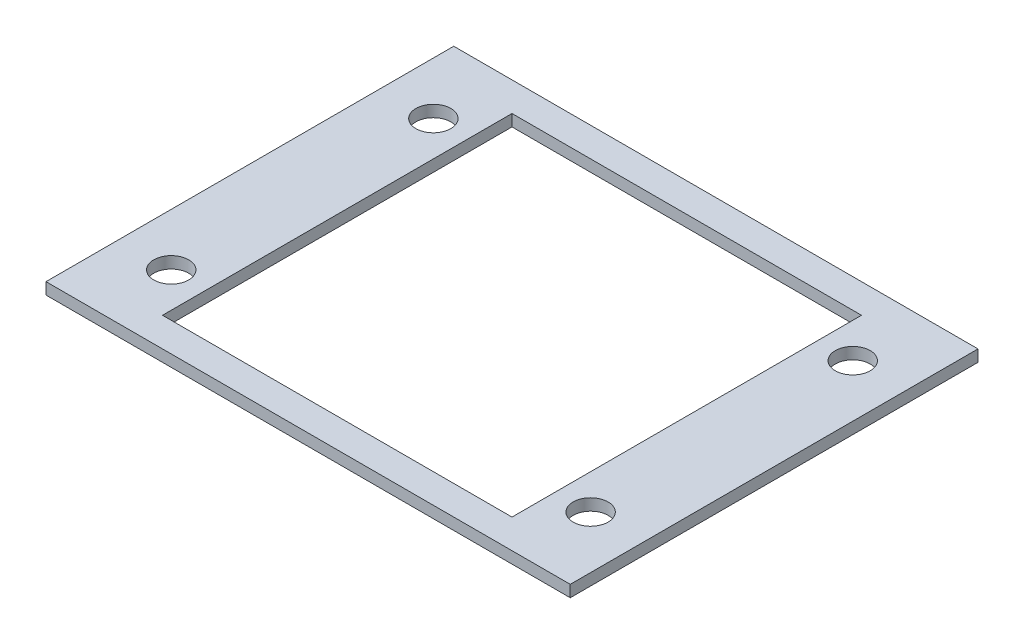
ISO-10303-21;
HEADER;
FILE_DESCRIPTION(('STEP AP214'),'2;1');
FILE_NAME('part.step','',(''),(''),'','','');
FILE_SCHEMA(('AUTOMOTIVE_DESIGN { 1 0 10303 214 1 1 1 1 }'));
ENDSEC;
DATA;
#1=APPLICATION_CONTEXT('core data for automotive mechanical design processes');
#2=APPLICATION_PROTOCOL_DEFINITION('international standard','automotive_design',2000,#1);
#3=PRODUCT_CONTEXT('',#1,'mechanical');
#4=PRODUCT('Part','Part','',(#3));
#5=PRODUCT_RELATED_PRODUCT_CATEGORY('part','',(#4));
#6=PRODUCT_DEFINITION_FORMATION('','',#4);
#7=PRODUCT_DEFINITION_CONTEXT('part definition',#1,'design');
#8=PRODUCT_DEFINITION('design','',#6,#7);
#9=PRODUCT_DEFINITION_SHAPE('','',#8);
#10=(LENGTH_UNIT() NAMED_UNIT(*) SI_UNIT(.MILLI.,.METRE.));
#11=(NAMED_UNIT(*) PLANE_ANGLE_UNIT() SI_UNIT($,.RADIAN.));
#12=(NAMED_UNIT(*) SI_UNIT($,.STERADIAN.) SOLID_ANGLE_UNIT());
#13=UNCERTAINTY_MEASURE_WITH_UNIT(LENGTH_MEASURE(1.E-05),#10,'distance_accuracy_value','');
#14=(GEOMETRIC_REPRESENTATION_CONTEXT(3) GLOBAL_UNCERTAINTY_ASSIGNED_CONTEXT((#13)) GLOBAL_UNIT_ASSIGNED_CONTEXT((#10,
#11,#12)) REPRESENTATION_CONTEXT('',''));
#15=CARTESIAN_POINT('',(0.,0.,0.));
#16=DIRECTION('',(0.,0.,1.));
#17=DIRECTION('',(1.,0.,0.));
#18=AXIS2_PLACEMENT_3D('',#15,#16,#17);
#19=CARTESIAN_POINT('',(-7.5,1.,0.));
#20=DIRECTION('',(-1.,0.,0.));
#21=DIRECTION('',(0.,0.,1.));
#22=AXIS2_PLACEMENT_3D('',#19,#20,#21);
#23=PLANE('',#22);
#24=DIRECTION('',(0.,1.,0.));
#25=VECTOR('',#24,1.);
#26=CARTESIAN_POINT('',(-7.5,-9.,-32.5));
#27=LINE('',#26,#25);
#28=CARTESIAN_POINT('',(-7.5,0.,-32.5));
#29=VERTEX_POINT('',#28);
#30=CARTESIAN_POINT('',(-7.5,1.,-32.5));
#31=VERTEX_POINT('',#30);
#32=EDGE_CURVE('E97',#29,#31,#27,.T.);
#33=ORIENTED_EDGE('',*,*,#32,.F.);
#34=DIRECTION('',(0.,0.,-1.));
#35=VECTOR('',#34,1.);
#36=CARTESIAN_POINT('',(-7.5,0.,0.));
#37=LINE('',#36,#35);
#38=CARTESIAN_POINT('',(-7.5,0.,2.5));
#39=VERTEX_POINT('',#38);
#40=EDGE_CURVE('E149',#39,#29,#37,.T.);
#41=ORIENTED_EDGE('',*,*,#40,.F.);
#42=DIRECTION('',(0.,1.,0.));
#43=VECTOR('',#42,1.);
#44=CARTESIAN_POINT('',(-7.5,-9.,2.5));
#45=LINE('',#44,#43);
#46=CARTESIAN_POINT('',(-7.5,1.,2.5));
#47=VERTEX_POINT('',#46);
#48=EDGE_CURVE('E57',#39,#47,#45,.T.);
#49=ORIENTED_EDGE('',*,*,#48,.T.);
#50=DIRECTION('',(0.,0.,-1.));
#51=VECTOR('',#50,1.);
#52=CARTESIAN_POINT('',(-7.5,1.,0.));
#53=LINE('',#52,#51);
#54=EDGE_CURVE('E112',#47,#31,#53,.T.);
#55=ORIENTED_EDGE('',*,*,#54,.T.);
#56=EDGE_LOOP('',(#33,#41,#49,#55));
#57=FACE_BOUND('',#56,.T.);
#58=ADVANCED_FACE('F35',(#57),#23,.T.);
#59=CARTESIAN_POINT('',(37.5,1.,0.));
#60=DIRECTION('',(-1.,0.,0.));
#61=DIRECTION('',(0.,0.,1.));
#62=AXIS2_PLACEMENT_3D('',#59,#60,#61);
#63=PLANE('',#62);
#64=DIRECTION('',(0.,0.,-1.));
#65=VECTOR('',#64,1.);
#66=CARTESIAN_POINT('',(37.5,0.,0.));
#67=LINE('',#66,#65);
#68=CARTESIAN_POINT('',(37.5,0.,2.5));
#69=VERTEX_POINT('',#68);
#70=CARTESIAN_POINT('',(37.5,0.,-32.5));
#71=VERTEX_POINT('',#70);
#72=EDGE_CURVE('E151',#69,#71,#67,.T.);
#73=ORIENTED_EDGE('',*,*,#72,.T.);
#74=DIRECTION('',(0.,1.,0.));
#75=VECTOR('',#74,1.);
#76=CARTESIAN_POINT('',(37.5,-9.,-32.5));
#77=LINE('',#76,#75);
#78=CARTESIAN_POINT('',(37.5,1.,-32.5));
#79=VERTEX_POINT('',#78);
#80=EDGE_CURVE('E50',#71,#79,#77,.T.);
#81=ORIENTED_EDGE('',*,*,#80,.T.);
#82=DIRECTION('',(0.,0.,-1.));
#83=VECTOR('',#82,1.);
#84=CARTESIAN_POINT('',(37.5,1.,0.));
#85=LINE('',#84,#83);
#86=CARTESIAN_POINT('',(37.5,1.,2.5));
#87=VERTEX_POINT('',#86);
#88=EDGE_CURVE('E114',#87,#79,#85,.T.);
#89=ORIENTED_EDGE('',*,*,#88,.F.);
#90=DIRECTION('',(0.,1.,0.));
#91=VECTOR('',#90,1.);
#92=CARTESIAN_POINT('',(37.5,-9.,2.5));
#93=LINE('',#92,#91);
#94=EDGE_CURVE('E167',#69,#87,#93,.T.);
#95=ORIENTED_EDGE('',*,*,#94,.F.);
#96=EDGE_LOOP('',(#73,#81,#89,#95));
#97=FACE_BOUND('',#96,.T.);
#98=ADVANCED_FACE('F169',(#97),#63,.F.);
#99=CARTESIAN_POINT('',(30.,1.,0.));
#100=DIRECTION('',(-1.,0.,0.));
#101=DIRECTION('',(0.,0.,1.));
#102=AXIS2_PLACEMENT_3D('',#99,#100,#101);
#103=PLANE('',#102);
#104=DIRECTION('',(0.,0.,-1.));
#105=VECTOR('',#104,1.);
#106=CARTESIAN_POINT('',(30.,0.,0.));
#107=LINE('',#106,#105);
#108=CARTESIAN_POINT('',(30.,0.,0.));
#109=VERTEX_POINT('',#108);
#110=CARTESIAN_POINT('',(30.,0.,-30.));
#111=VERTEX_POINT('',#110);
#112=EDGE_CURVE('E134',#109,#111,#107,.T.);
#113=ORIENTED_EDGE('',*,*,#112,.F.);
#114=DIRECTION('',(0.,-1.,0.));
#115=VECTOR('',#114,1.);
#116=CARTESIAN_POINT('',(30.,1.,0.));
#117=LINE('',#116,#115);
#118=CARTESIAN_POINT('',(30.,1.,0.));
#119=VERTEX_POINT('',#118);
#120=EDGE_CURVE('E161',#119,#109,#117,.T.);
#121=ORIENTED_EDGE('',*,*,#120,.F.);
#122=DIRECTION('',(0.,0.,-1.));
#123=VECTOR('',#122,1.);
#124=CARTESIAN_POINT('',(30.,1.,0.));
#125=LINE('',#124,#123);
#126=CARTESIAN_POINT('',(30.,1.,-30.));
#127=VERTEX_POINT('',#126);
#128=EDGE_CURVE('E183',#119,#127,#125,.T.);
#129=ORIENTED_EDGE('',*,*,#128,.T.);
#130=DIRECTION('',(0.,-1.,0.));
#131=VECTOR('',#130,1.);
#132=CARTESIAN_POINT('',(30.,1.,-30.));
#133=LINE('',#132,#131);
#134=EDGE_CURVE('E118',#127,#111,#133,.T.);
#135=ORIENTED_EDGE('',*,*,#134,.T.);
#136=EDGE_LOOP('',(#113,#121,#129,#135));
#137=FACE_BOUND('',#136,.T.);
#138=ADVANCED_FACE('F202',(#137),#103,.T.);
#139=CARTESIAN_POINT('',(0.,1.,0.));
#140=DIRECTION('',(0.,0.,-1.));
#141=DIRECTION('',(-1.,0.,0.));
#142=AXIS2_PLACEMENT_3D('',#139,#140,#141);
#143=PLANE('',#142);
#144=DIRECTION('',(1.,0.,0.));
#145=VECTOR('',#144,1.);
#146=CARTESIAN_POINT('',(0.,0.,0.));
#147=LINE('',#146,#145);
#148=CARTESIAN_POINT('',(0.,0.,0.));
#149=VERTEX_POINT('',#148);
#150=EDGE_CURVE('E137',#149,#109,#147,.T.);
#151=ORIENTED_EDGE('',*,*,#150,.F.);
#152=DIRECTION('',(0.,-1.,0.));
#153=VECTOR('',#152,1.);
#154=CARTESIAN_POINT('',(0.,1.,0.));
#155=LINE('',#154,#153);
#156=CARTESIAN_POINT('',(0.,1.,0.));
#157=VERTEX_POINT('',#156);
#158=EDGE_CURVE('E159',#157,#149,#155,.T.);
#159=ORIENTED_EDGE('',*,*,#158,.F.);
#160=DIRECTION('',(1.,0.,0.));
#161=VECTOR('',#160,1.);
#162=CARTESIAN_POINT('',(0.,1.,0.));
#163=LINE('',#162,#161);
#164=EDGE_CURVE('E186',#157,#119,#163,.T.);
#165=ORIENTED_EDGE('',*,*,#164,.T.);
#166=ORIENTED_EDGE('',*,*,#120,.T.);
#167=EDGE_LOOP('',(#151,#159,#165,#166));
#168=FACE_BOUND('',#167,.T.);
#169=ADVANCED_FACE('F205',(#168),#143,.T.);
#170=CARTESIAN_POINT('',(0.,1.,0.));
#171=DIRECTION('',(-1.,0.,0.));
#172=DIRECTION('',(0.,0.,1.));
#173=AXIS2_PLACEMENT_3D('',#170,#171,#172);
#174=PLANE('',#173);
#175=DIRECTION('',(0.,0.,-1.));
#176=VECTOR('',#175,1.);
#177=CARTESIAN_POINT('',(0.,0.,0.));
#178=LINE('',#177,#176);
#179=CARTESIAN_POINT('',(0.,0.,-30.));
#180=VERTEX_POINT('',#179);
#181=EDGE_CURVE('E140',#149,#180,#178,.T.);
#182=ORIENTED_EDGE('',*,*,#181,.T.);
#183=DIRECTION('',(0.,-1.,0.));
#184=VECTOR('',#183,1.);
#185=CARTESIAN_POINT('',(0.,1.,-30.));
#186=LINE('',#185,#184);
#187=CARTESIAN_POINT('',(0.,1.,-30.));
#188=VERTEX_POINT('',#187);
#189=EDGE_CURVE('E156',#188,#180,#186,.T.);
#190=ORIENTED_EDGE('',*,*,#189,.F.);
#191=DIRECTION('',(0.,0.,-1.));
#192=VECTOR('',#191,1.);
#193=CARTESIAN_POINT('',(0.,1.,0.));
#194=LINE('',#193,#192);
#195=EDGE_CURVE('E189',#157,#188,#194,.T.);
#196=ORIENTED_EDGE('',*,*,#195,.F.);
#197=ORIENTED_EDGE('',*,*,#158,.T.);
#198=EDGE_LOOP('',(#182,#190,#196,#197));
#199=FACE_BOUND('',#198,.T.);
#200=ADVANCED_FACE('F208',(#199),#174,.F.);
#201=CARTESIAN_POINT('',(-3.,1.,-3.75000000000001));
#202=DIRECTION('',(0.,-1.,0.));
#203=DIRECTION('',(0.,0.,-1.));
#204=AXIS2_PLACEMENT_3D('',#201,#202,#203);
#205=CYLINDRICAL_SURFACE('',#204,1.5);
#206=CARTESIAN_POINT('',(-3.,1.,-3.75000000000001));
#207=DIRECTION('',(0.,1.,0.));
#208=DIRECTION('',(0.,0.,1.));
#209=AXIS2_PLACEMENT_3D('',#206,#207,#208);
#210=CIRCLE('',#209,1.5);
#211=CARTESIAN_POINT('',(-3.,1.,-2.25000000000001));
#212=VERTEX_POINT('',#211);
#213=EDGE_CURVE('E116',#212,#212,#210,.F.);
#214=ORIENTED_EDGE('',*,*,#213,.F.);
#215=EDGE_LOOP('',(#214));
#216=FACE_BOUND('',#215,.T.);
#217=CARTESIAN_POINT('',(-3.,0.,-3.75000000000001));
#218=DIRECTION('',(0.,1.,0.));
#219=DIRECTION('',(0.,0.,1.));
#220=AXIS2_PLACEMENT_3D('',#217,#218,#219);
#221=CIRCLE('',#220,1.5);
#222=CARTESIAN_POINT('',(-3.,0.,-2.25000000000001));
#223=VERTEX_POINT('',#222);
#224=EDGE_CURVE('E146',#223,#223,#221,.F.);
#225=ORIENTED_EDGE('',*,*,#224,.T.);
#226=EDGE_LOOP('',(#225));
#227=FACE_BOUND('',#226,.T.);
#228=ADVANCED_FACE('F216',(#216,#227),#205,.F.);
#229=CARTESIAN_POINT('',(0.,1.,-30.));
#230=DIRECTION('',(0.,0.,-1.));
#231=DIRECTION('',(-1.,0.,0.));
#232=AXIS2_PLACEMENT_3D('',#229,#230,#231);
#233=PLANE('',#232);
#234=DIRECTION('',(1.,0.,0.));
#235=VECTOR('',#234,1.);
#236=CARTESIAN_POINT('',(0.,0.,-30.));
#237=LINE('',#236,#235);
#238=EDGE_CURVE('E143',#180,#111,#237,.T.);
#239=ORIENTED_EDGE('',*,*,#238,.T.);
#240=ORIENTED_EDGE('',*,*,#134,.F.);
#241=DIRECTION('',(1.,0.,0.));
#242=VECTOR('',#241,1.);
#243=CARTESIAN_POINT('',(0.,1.,-30.));
#244=LINE('',#243,#242);
#245=EDGE_CURVE('E121',#188,#127,#244,.T.);
#246=ORIENTED_EDGE('',*,*,#245,.F.);
#247=ORIENTED_EDGE('',*,*,#189,.T.);
#248=EDGE_LOOP('',(#239,#240,#246,#247));
#249=FACE_BOUND('',#248,.T.);
#250=ADVANCED_FACE('F199',(#249),#233,.F.);
#251=CARTESIAN_POINT('',(-3.,1.,-26.25));
#252=DIRECTION('',(0.,-1.,0.));
#253=DIRECTION('',(0.,0.,-1.));
#254=AXIS2_PLACEMENT_3D('',#251,#252,#253);
#255=CYLINDRICAL_SURFACE('',#254,1.5);
#256=CARTESIAN_POINT('',(-3.,1.,-26.25));
#257=DIRECTION('',(0.,1.,0.));
#258=DIRECTION('',(0.,0.,1.));
#259=AXIS2_PLACEMENT_3D('',#256,#257,#258);
#260=CIRCLE('',#259,1.5);
#261=CARTESIAN_POINT('',(-3.,1.,-24.75));
#262=VERTEX_POINT('',#261);
#263=EDGE_CURVE('E180',#262,#262,#260,.F.);
#264=ORIENTED_EDGE('',*,*,#263,.F.);
#265=EDGE_LOOP('',(#264));
#266=FACE_BOUND('',#265,.T.);
#267=CARTESIAN_POINT('',(-3.,0.,-26.25));
#268=DIRECTION('',(0.,1.,0.));
#269=DIRECTION('',(0.,0.,1.));
#270=AXIS2_PLACEMENT_3D('',#267,#268,#269);
#271=CIRCLE('',#270,1.5);
#272=CARTESIAN_POINT('',(-3.,0.,-24.75));
#273=VERTEX_POINT('',#272);
#274=EDGE_CURVE('E131',#273,#273,#271,.F.);
#275=ORIENTED_EDGE('',*,*,#274,.T.);
#276=EDGE_LOOP('',(#275));
#277=FACE_BOUND('',#276,.T.);
#278=ADVANCED_FACE('F224',(#266,#277),#255,.F.);
#279=CARTESIAN_POINT('',(33.,1.,-26.25));
#280=DIRECTION('',(0.,-1.,0.));
#281=DIRECTION('',(0.,0.,-1.));
#282=AXIS2_PLACEMENT_3D('',#279,#280,#281);
#283=CYLINDRICAL_SURFACE('',#282,1.5);
#284=CARTESIAN_POINT('',(33.,1.,-26.25));
#285=DIRECTION('',(0.,1.,0.));
#286=DIRECTION('',(0.,0.,1.));
#287=AXIS2_PLACEMENT_3D('',#284,#285,#286);
#288=CIRCLE('',#287,1.5);
#289=CARTESIAN_POINT('',(33.,1.,-24.75));
#290=VERTEX_POINT('',#289);
#291=EDGE_CURVE('E177',#290,#290,#288,.T.);
#292=ORIENTED_EDGE('',*,*,#291,.T.);
#293=EDGE_LOOP('',(#292));
#294=FACE_BOUND('',#293,.T.);
#295=CARTESIAN_POINT('',(33.,0.,-26.25));
#296=DIRECTION('',(0.,1.,0.));
#297=DIRECTION('',(0.,0.,1.));
#298=AXIS2_PLACEMENT_3D('',#295,#296,#297);
#299=CIRCLE('',#298,1.5);
#300=CARTESIAN_POINT('',(33.,0.,-24.75));
#301=VERTEX_POINT('',#300);
#302=EDGE_CURVE('E128',#301,#301,#299,.T.);
#303=ORIENTED_EDGE('',*,*,#302,.F.);
#304=EDGE_LOOP('',(#303));
#305=FACE_BOUND('',#304,.T.);
#306=ADVANCED_FACE('F261',(#294,#305),#283,.F.);
#307=CARTESIAN_POINT('',(33.,1.,-3.75000000000001));
#308=DIRECTION('',(0.,-1.,0.));
#309=DIRECTION('',(0.,0.,-1.));
#310=AXIS2_PLACEMENT_3D('',#307,#308,#309);
#311=CYLINDRICAL_SURFACE('',#310,1.5);
#312=CARTESIAN_POINT('',(33.,1.,-3.75000000000001));
#313=DIRECTION('',(0.,1.,0.));
#314=DIRECTION('',(0.,0.,1.));
#315=AXIS2_PLACEMENT_3D('',#312,#313,#314);
#316=CIRCLE('',#315,1.5);
#317=CARTESIAN_POINT('',(33.,1.,-2.25));
#318=VERTEX_POINT('',#317);
#319=EDGE_CURVE('E154',#318,#318,#316,.T.);
#320=ORIENTED_EDGE('',*,*,#319,.T.);
#321=EDGE_LOOP('',(#320));
#322=FACE_BOUND('',#321,.T.);
#323=CARTESIAN_POINT('',(33.,0.,-3.75000000000001));
#324=DIRECTION('',(0.,1.,0.));
#325=DIRECTION('',(0.,0.,1.));
#326=AXIS2_PLACEMENT_3D('',#323,#324,#325);
#327=CIRCLE('',#326,1.5);
#328=CARTESIAN_POINT('',(33.,0.,-2.25));
#329=VERTEX_POINT('',#328);
#330=EDGE_CURVE('E125',#329,#329,#327,.T.);
#331=ORIENTED_EDGE('',*,*,#330,.F.);
#332=EDGE_LOOP('',(#331));
#333=FACE_BOUND('',#332,.T.);
#334=ADVANCED_FACE('F37',(#322,#333),#311,.F.);
#335=CARTESIAN_POINT('',(0.,1.,0.));
#336=DIRECTION('',(0.,1.,0.));
#337=DIRECTION('',(0.,0.,1.));
#338=AXIS2_PLACEMENT_3D('',#335,#336,#337);
#339=PLANE('',#338);
#340=DIRECTION('',(1.,0.,0.));
#341=VECTOR('',#340,1.);
#342=CARTESIAN_POINT('',(-7.5,1.,-32.5));
#343=LINE('',#342,#341);
#344=EDGE_CURVE('E100',#31,#79,#343,.T.);
#345=ORIENTED_EDGE('',*,*,#344,.F.);
#346=ORIENTED_EDGE('',*,*,#54,.F.);
#347=DIRECTION('',(-1.,0.,0.));
#348=VECTOR('',#347,1.);
#349=CARTESIAN_POINT('',(37.5,1.,2.5));
#350=LINE('',#349,#348);
#351=EDGE_CURVE('E170',#87,#47,#350,.T.);
#352=ORIENTED_EDGE('',*,*,#351,.F.);
#353=ORIENTED_EDGE('',*,*,#88,.T.);
#354=EDGE_LOOP('',(#345,#346,#352,#353));
#355=FACE_BOUND('',#354,.T.);
#356=ORIENTED_EDGE('',*,*,#319,.F.);
#357=EDGE_LOOP('',(#356));
#358=FACE_BOUND('',#357,.T.);
#359=ORIENTED_EDGE('',*,*,#291,.F.);
#360=EDGE_LOOP('',(#359));
#361=FACE_BOUND('',#360,.T.);
#362=ORIENTED_EDGE('',*,*,#263,.T.);
#363=EDGE_LOOP('',(#362));
#364=FACE_BOUND('',#363,.T.);
#365=ORIENTED_EDGE('',*,*,#128,.F.);
#366=ORIENTED_EDGE('',*,*,#164,.F.);
#367=ORIENTED_EDGE('',*,*,#195,.T.);
#368=ORIENTED_EDGE('',*,*,#245,.T.);
#369=EDGE_LOOP('',(#365,#366,#367,#368));
#370=FACE_BOUND('',#369,.T.);
#371=ORIENTED_EDGE('',*,*,#213,.T.);
#372=EDGE_LOOP('',(#371));
#373=FACE_BOUND('',#372,.T.);
#374=ADVANCED_FACE('F109',(#355,#358,#361,#364,#370,#373),#339,.T.);
#375=CARTESIAN_POINT('',(0.,0.,0.));
#376=DIRECTION('',(0.,1.,0.));
#377=DIRECTION('',(0.,0.,1.));
#378=AXIS2_PLACEMENT_3D('',#375,#376,#377);
#379=PLANE('',#378);
#380=ORIENTED_EDGE('',*,*,#330,.T.);
#381=EDGE_LOOP('',(#380));
#382=FACE_BOUND('',#381,.T.);
#383=ORIENTED_EDGE('',*,*,#302,.T.);
#384=EDGE_LOOP('',(#383));
#385=FACE_BOUND('',#384,.T.);
#386=ORIENTED_EDGE('',*,*,#274,.F.);
#387=EDGE_LOOP('',(#386));
#388=FACE_BOUND('',#387,.T.);
#389=ORIENTED_EDGE('',*,*,#112,.T.);
#390=ORIENTED_EDGE('',*,*,#238,.F.);
#391=ORIENTED_EDGE('',*,*,#181,.F.);
#392=ORIENTED_EDGE('',*,*,#150,.T.);
#393=EDGE_LOOP('',(#389,#390,#391,#392));
#394=FACE_BOUND('',#393,.T.);
#395=ORIENTED_EDGE('',*,*,#224,.F.);
#396=EDGE_LOOP('',(#395));
#397=FACE_BOUND('',#396,.T.);
#398=ORIENTED_EDGE('',*,*,#40,.T.);
#399=DIRECTION('',(1.,0.,0.));
#400=VECTOR('',#399,1.);
#401=CARTESIAN_POINT('',(0.,0.,-32.5));
#402=LINE('',#401,#400);
#403=EDGE_CURVE('E11',#29,#71,#402,.T.);
#404=ORIENTED_EDGE('',*,*,#403,.T.);
#405=ORIENTED_EDGE('',*,*,#72,.F.);
#406=DIRECTION('',(-1.,0.,0.));
#407=VECTOR('',#406,1.);
#408=CARTESIAN_POINT('',(0.,0.,2.5));
#409=LINE('',#408,#407);
#410=EDGE_CURVE('E43',#69,#39,#409,.T.);
#411=ORIENTED_EDGE('',*,*,#410,.T.);
#412=EDGE_LOOP('',(#398,#404,#405,#411));
#413=FACE_BOUND('',#412,.T.);
#414=ADVANCED_FACE('F164',(#382,#385,#388,#394,#397,#413),#379,.F.);
#415=CARTESIAN_POINT('',(37.5,-9.,2.5));
#416=DIRECTION('',(0.,0.,-1.));
#417=DIRECTION('',(-1.,0.,0.));
#418=AXIS2_PLACEMENT_3D('',#415,#416,#417);
#419=PLANE('',#418);
#420=ORIENTED_EDGE('',*,*,#94,.T.);
#421=ORIENTED_EDGE('',*,*,#351,.T.);
#422=ORIENTED_EDGE('',*,*,#48,.F.);
#423=ORIENTED_EDGE('',*,*,#410,.F.);
#424=EDGE_LOOP('',(#420,#421,#422,#423));
#425=FACE_BOUND('',#424,.T.);
#426=ADVANCED_FACE('F166',(#425),#419,.F.);
#427=CARTESIAN_POINT('',(-7.5,-9.,-32.5));
#428=DIRECTION('',(0.,0.,1.));
#429=DIRECTION('',(1.,0.,0.));
#430=AXIS2_PLACEMENT_3D('',#427,#428,#429);
#431=PLANE('',#430);
#432=ORIENTED_EDGE('',*,*,#32,.T.);
#433=ORIENTED_EDGE('',*,*,#344,.T.);
#434=ORIENTED_EDGE('',*,*,#80,.F.);
#435=ORIENTED_EDGE('',*,*,#403,.F.);
#436=EDGE_LOOP('',(#432,#433,#434,#435));
#437=FACE_BOUND('',#436,.T.);
#438=ADVANCED_FACE('F99',(#437),#431,.F.);
#439=CLOSED_SHELL('',(#58,#98,#138,#169,#200,#228,#250,#278,#306,#334,#374,#414,#426,#438));
#440=MANIFOLD_SOLID_BREP('B2',#439);
#441=ADVANCED_BREP_SHAPE_REPRESENTATION('',(#18,#440),#14);
#442=SHAPE_DEFINITION_REPRESENTATION(#9,#441);
ENDSEC;
END-ISO-10303-21;
